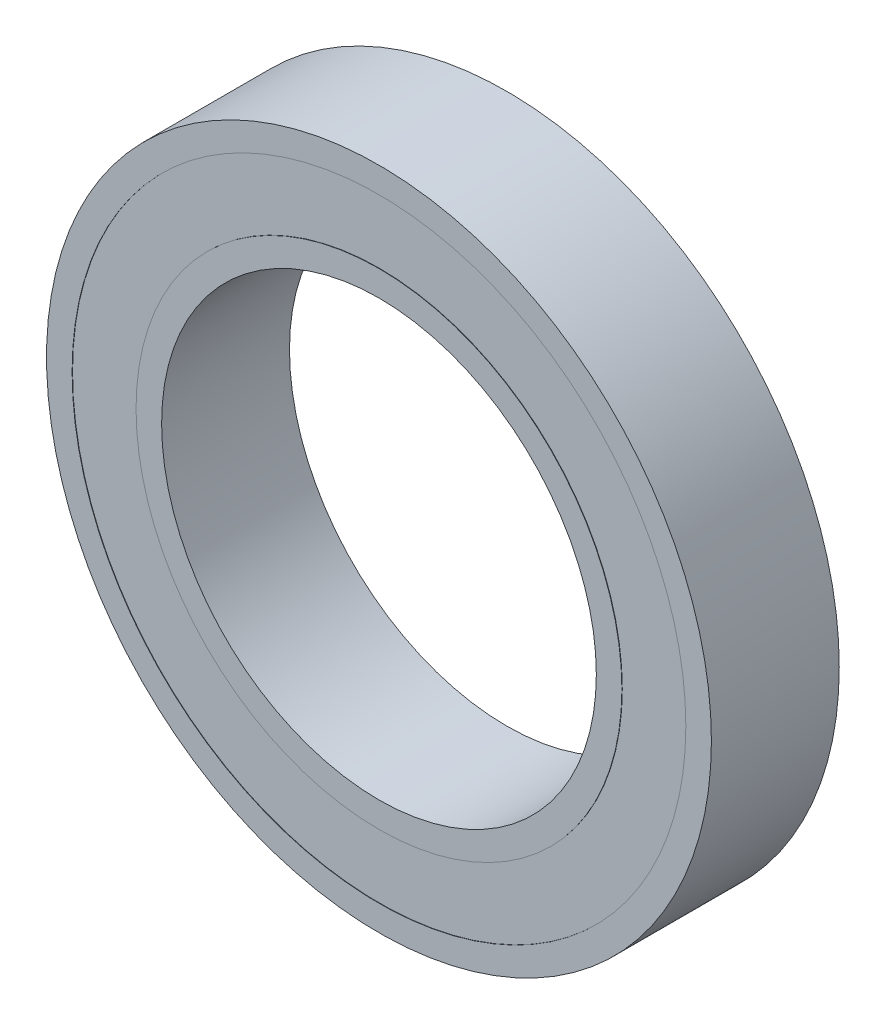
ISO-10303-21;
HEADER;
FILE_DESCRIPTION(('STEP AP214'),'2;1');
FILE_NAME('part.step','',(''),(''),'','','');
FILE_SCHEMA(('AUTOMOTIVE_DESIGN { 1 0 10303 214 1 1 1 1 }'));
ENDSEC;
DATA;
#1=APPLICATION_CONTEXT('core data for automotive mechanical design processes');
#2=APPLICATION_PROTOCOL_DEFINITION('international standard','automotive_design',2000,#1);
#3=PRODUCT_CONTEXT('',#1,'mechanical');
#4=PRODUCT('Part','Part','',(#3));
#5=PRODUCT_RELATED_PRODUCT_CATEGORY('part','',(#4));
#6=PRODUCT_DEFINITION_FORMATION('','',#4);
#7=PRODUCT_DEFINITION_CONTEXT('part definition',#1,'design');
#8=PRODUCT_DEFINITION('design','',#6,#7);
#9=PRODUCT_DEFINITION_SHAPE('','',#8);
#10=(LENGTH_UNIT() NAMED_UNIT(*) SI_UNIT(.MILLI.,.METRE.));
#11=(NAMED_UNIT(*) PLANE_ANGLE_UNIT() SI_UNIT($,.RADIAN.));
#12=(NAMED_UNIT(*) SI_UNIT($,.STERADIAN.) SOLID_ANGLE_UNIT());
#13=UNCERTAINTY_MEASURE_WITH_UNIT(LENGTH_MEASURE(1.E-05),#10,'distance_accuracy_value','');
#14=(GEOMETRIC_REPRESENTATION_CONTEXT(3) GLOBAL_UNCERTAINTY_ASSIGNED_CONTEXT((#13)) GLOBAL_UNIT_ASSIGNED_CONTEXT((#10,
#11,#12)) REPRESENTATION_CONTEXT('',''));
#15=CARTESIAN_POINT('',(0.,0.,0.));
#16=DIRECTION('',(0.,0.,1.));
#17=DIRECTION('',(1.,0.,0.));
#18=AXIS2_PLACEMENT_3D('',#15,#16,#17);
#19=CARTESIAN_POINT('',(0.,0.,-2.5));
#20=DIRECTION('',(0.,0.,1.));
#21=DIRECTION('',(1.,0.,0.));
#22=AXIS2_PLACEMENT_3D('',#19,#20,#21);
#23=CYLINDRICAL_SURFACE('',#22,12.);
#24=CARTESIAN_POINT('',(0.,0.,-2.5));
#25=DIRECTION('',(0.,0.,1.));
#26=DIRECTION('',(1.,0.,0.));
#27=AXIS2_PLACEMENT_3D('',#24,#25,#26);
#28=CIRCLE('',#27,12.);
#29=CARTESIAN_POINT('',(12.,0.,-2.5));
#30=VERTEX_POINT('',#29);
#31=EDGE_CURVE('E60',#30,#30,#28,.T.);
#32=ORIENTED_EDGE('',*,*,#31,.F.);
#33=EDGE_LOOP('',(#32));
#34=FACE_BOUND('',#33,.T.);
#35=CARTESIAN_POINT('',(0.,0.,-2.484375));
#36=DIRECTION('',(0.,0.,1.));
#37=DIRECTION('',(1.,0.,0.));
#38=AXIS2_PLACEMENT_3D('',#35,#36,#37);
#39=CIRCLE('',#38,12.);
#40=CARTESIAN_POINT('',(12.,0.,-2.484375));
#41=VERTEX_POINT('',#40);
#42=EDGE_CURVE('E11',#41,#41,#39,.F.);
#43=ORIENTED_EDGE('',*,*,#42,.F.);
#44=EDGE_LOOP('',(#43));
#45=FACE_BOUND('',#44,.T.);
#46=ADVANCED_FACE('F49',(#34,#45),#23,.F.);
#47=CARTESIAN_POINT('',(0.,0.,2.484375));
#48=DIRECTION('',(0.,0.,1.));
#49=DIRECTION('',(1.,0.,0.));
#50=AXIS2_PLACEMENT_3D('',#47,#48,#49);
#51=CIRCLE('',#50,12.);
#52=CARTESIAN_POINT('',(12.,0.,2.484375));
#53=VERTEX_POINT('',#52);
#54=EDGE_CURVE('E72',#53,#53,#51,.T.);
#55=ORIENTED_EDGE('',*,*,#54,.F.);
#56=EDGE_LOOP('',(#55));
#57=FACE_BOUND('',#56,.T.);
#58=CARTESIAN_POINT('',(0.,0.,2.5));
#59=DIRECTION('',(0.,0.,1.));
#60=DIRECTION('',(1.,0.,0.));
#61=AXIS2_PLACEMENT_3D('',#58,#59,#60);
#62=CIRCLE('',#61,12.);
#63=CARTESIAN_POINT('',(12.,0.,2.5));
#64=VERTEX_POINT('',#63);
#65=EDGE_CURVE('E69',#64,#64,#62,.T.);
#66=ORIENTED_EDGE('',*,*,#65,.T.);
#67=EDGE_LOOP('',(#66));
#68=FACE_BOUND('',#67,.T.);
#69=ADVANCED_FACE('F51',(#57,#68),#23,.F.);
#70=CARTESIAN_POINT('',(0.,0.,-2.5));
#71=DIRECTION('',(0.,0.,1.));
#72=DIRECTION('',(1.,0.,0.));
#73=AXIS2_PLACEMENT_3D('',#70,#71,#72);
#74=CYLINDRICAL_SURFACE('',#73,13.);
#75=CARTESIAN_POINT('',(0.,0.,-2.5));
#76=DIRECTION('',(0.,0.,1.));
#77=DIRECTION('',(1.,0.,0.));
#78=AXIS2_PLACEMENT_3D('',#75,#76,#77);
#79=CIRCLE('',#78,13.);
#80=CARTESIAN_POINT('',(13.,0.,-2.5));
#81=VERTEX_POINT('',#80);
#82=EDGE_CURVE('E56',#81,#81,#79,.T.);
#83=ORIENTED_EDGE('',*,*,#82,.T.);
#84=EDGE_LOOP('',(#83));
#85=FACE_BOUND('',#84,.T.);
#86=CARTESIAN_POINT('',(0.,0.,2.5));
#87=DIRECTION('',(0.,0.,1.));
#88=DIRECTION('',(1.,0.,0.));
#89=AXIS2_PLACEMENT_3D('',#86,#87,#88);
#90=CIRCLE('',#89,13.);
#91=CARTESIAN_POINT('',(13.,0.,2.5));
#92=VERTEX_POINT('',#91);
#93=EDGE_CURVE('E64',#92,#92,#90,.T.);
#94=ORIENTED_EDGE('',*,*,#93,.F.);
#95=EDGE_LOOP('',(#94));
#96=FACE_BOUND('',#95,.T.);
#97=ADVANCED_FACE('F124',(#85,#96),#74,.T.);
#98=CARTESIAN_POINT('',(0.,0.,-2.5));
#99=DIRECTION('',(0.,0.,1.));
#100=DIRECTION('',(1.,0.,0.));
#101=AXIS2_PLACEMENT_3D('',#98,#99,#100);
#102=PLANE('',#101);
#103=ORIENTED_EDGE('',*,*,#31,.T.);
#104=EDGE_LOOP('',(#103));
#105=FACE_BOUND('',#104,.T.);
#106=ORIENTED_EDGE('',*,*,#82,.F.);
#107=EDGE_LOOP('',(#106));
#108=FACE_BOUND('',#107,.T.);
#109=ADVANCED_FACE('F129',(#105,#108),#102,.F.);
#110=CARTESIAN_POINT('',(0.,0.,2.5));
#111=DIRECTION('',(0.,0.,1.));
#112=DIRECTION('',(1.,0.,0.));
#113=AXIS2_PLACEMENT_3D('',#110,#111,#112);
#114=PLANE('',#113);
#115=ORIENTED_EDGE('',*,*,#65,.F.);
#116=EDGE_LOOP('',(#115));
#117=FACE_BOUND('',#116,.T.);
#118=ORIENTED_EDGE('',*,*,#93,.T.);
#119=EDGE_LOOP('',(#118));
#120=FACE_BOUND('',#119,.T.);
#121=ADVANCED_FACE('F132',(#117,#120),#114,.T.);
#122=CARTESIAN_POINT('',(0.,0.,-2.484375));
#123=DIRECTION('',(0.,0.,1.));
#124=DIRECTION('',(1.,0.,0.));
#125=AXIS2_PLACEMENT_3D('',#122,#123,#124);
#126=PLANE('',#125);
#127=CARTESIAN_POINT('',(0.,0.,-2.484375));
#128=DIRECTION('',(0.,0.,1.));
#129=DIRECTION('',(1.,0.,0.));
#130=AXIS2_PLACEMENT_3D('',#127,#128,#129);
#131=CIRCLE('',#130,9.5);
#132=CARTESIAN_POINT('',(9.5,0.,-2.484375));
#133=VERTEX_POINT('',#132);
#134=EDGE_CURVE('E78',#133,#133,#131,.T.);
#135=ORIENTED_EDGE('',*,*,#134,.T.);
#136=EDGE_LOOP('',(#135));
#137=FACE_BOUND('',#136,.T.);
#138=ORIENTED_EDGE('',*,*,#42,.T.);
#139=EDGE_LOOP('',(#138));
#140=FACE_BOUND('',#139,.T.);
#141=ADVANCED_FACE('F138',(#137,#140),#126,.F.);
#142=CARTESIAN_POINT('',(0.,0.,2.484375));
#143=DIRECTION('',(0.,0.,1.));
#144=DIRECTION('',(1.,0.,0.));
#145=AXIS2_PLACEMENT_3D('',#142,#143,#144);
#146=PLANE('',#145);
#147=CARTESIAN_POINT('',(0.,0.,2.484375));
#148=DIRECTION('',(0.,0.,1.));
#149=DIRECTION('',(1.,0.,0.));
#150=AXIS2_PLACEMENT_3D('',#147,#148,#149);
#151=CIRCLE('',#150,9.5);
#152=CARTESIAN_POINT('',(9.5,0.,2.484375));
#153=VERTEX_POINT('',#152);
#154=EDGE_CURVE('E75',#153,#153,#151,.T.);
#155=ORIENTED_EDGE('',*,*,#154,.F.);
#156=EDGE_LOOP('',(#155));
#157=FACE_BOUND('',#156,.T.);
#158=ORIENTED_EDGE('',*,*,#54,.T.);
#159=EDGE_LOOP('',(#158));
#160=FACE_BOUND('',#159,.T.);
#161=ADVANCED_FACE('F117',(#157,#160),#146,.T.);
#162=CARTESIAN_POINT('',(0.,0.,-2.5));
#163=DIRECTION('',(0.,0.,1.));
#164=DIRECTION('',(1.,0.,0.));
#165=AXIS2_PLACEMENT_3D('',#162,#163,#164);
#166=CYLINDRICAL_SURFACE('',#165,9.5);
#167=CARTESIAN_POINT('',(0.,0.,-2.5));
#168=DIRECTION('',(0.,0.,1.));
#169=DIRECTION('',(1.,0.,0.));
#170=AXIS2_PLACEMENT_3D('',#167,#168,#169);
#171=CIRCLE('',#170,9.5);
#172=CARTESIAN_POINT('',(9.5,0.,-2.5));
#173=VERTEX_POINT('',#172);
#174=EDGE_CURVE('E81',#173,#173,#171,.T.);
#175=ORIENTED_EDGE('',*,*,#174,.T.);
#176=EDGE_LOOP('',(#175));
#177=FACE_BOUND('',#176,.T.);
#178=ORIENTED_EDGE('',*,*,#134,.F.);
#179=EDGE_LOOP('',(#178));
#180=FACE_BOUND('',#179,.T.);
#181=ADVANCED_FACE('F107',(#177,#180),#166,.T.);
#182=CARTESIAN_POINT('',(0.,0.,-2.5));
#183=DIRECTION('',(0.,0.,1.));
#184=DIRECTION('',(1.,0.,0.));
#185=AXIS2_PLACEMENT_3D('',#182,#183,#184);
#186=CYLINDRICAL_SURFACE('',#185,8.5);
#187=CARTESIAN_POINT('',(0.,0.,-2.5));
#188=DIRECTION('',(0.,0.,1.));
#189=DIRECTION('',(1.,0.,0.));
#190=AXIS2_PLACEMENT_3D('',#187,#188,#189);
#191=CIRCLE('',#190,8.5);
#192=CARTESIAN_POINT('',(8.5,0.,-2.5));
#193=VERTEX_POINT('',#192);
#194=EDGE_CURVE('E84',#193,#193,#191,.T.);
#195=ORIENTED_EDGE('',*,*,#194,.F.);
#196=EDGE_LOOP('',(#195));
#197=FACE_BOUND('',#196,.T.);
#198=CARTESIAN_POINT('',(0.,0.,2.5));
#199=DIRECTION('',(0.,0.,1.));
#200=DIRECTION('',(1.,0.,0.));
#201=AXIS2_PLACEMENT_3D('',#198,#199,#200);
#202=CIRCLE('',#201,8.5);
#203=CARTESIAN_POINT('',(8.5,0.,2.5));
#204=VERTEX_POINT('',#203);
#205=EDGE_CURVE('E90',#204,#204,#202,.T.);
#206=ORIENTED_EDGE('',*,*,#205,.T.);
#207=EDGE_LOOP('',(#206));
#208=FACE_BOUND('',#207,.T.);
#209=ADVANCED_FACE('F94',(#197,#208),#186,.F.);
#210=ORIENTED_EDGE('',*,*,#154,.T.);
#211=EDGE_LOOP('',(#210));
#212=FACE_BOUND('',#211,.T.);
#213=CARTESIAN_POINT('',(0.,0.,2.5));
#214=DIRECTION('',(0.,0.,1.));
#215=DIRECTION('',(1.,0.,0.));
#216=AXIS2_PLACEMENT_3D('',#213,#214,#215);
#217=CIRCLE('',#216,9.5);
#218=CARTESIAN_POINT('',(9.5,0.,2.5));
#219=VERTEX_POINT('',#218);
#220=EDGE_CURVE('E87',#219,#219,#217,.T.);
#221=ORIENTED_EDGE('',*,*,#220,.F.);
#222=EDGE_LOOP('',(#221));
#223=FACE_BOUND('',#222,.T.);
#224=ADVANCED_FACE('F103',(#212,#223),#166,.T.);
#225=CARTESIAN_POINT('',(0.,0.,-2.5));
#226=DIRECTION('',(0.,0.,1.));
#227=DIRECTION('',(1.,0.,0.));
#228=AXIS2_PLACEMENT_3D('',#225,#226,#227);
#229=PLANE('',#228);
#230=ORIENTED_EDGE('',*,*,#194,.T.);
#231=EDGE_LOOP('',(#230));
#232=FACE_BOUND('',#231,.T.);
#233=ORIENTED_EDGE('',*,*,#174,.F.);
#234=EDGE_LOOP('',(#233));
#235=FACE_BOUND('',#234,.T.);
#236=ADVANCED_FACE('F99',(#232,#235),#229,.F.);
#237=CARTESIAN_POINT('',(0.,0.,2.5));
#238=DIRECTION('',(0.,0.,1.));
#239=DIRECTION('',(1.,0.,0.));
#240=AXIS2_PLACEMENT_3D('',#237,#238,#239);
#241=PLANE('',#240);
#242=ORIENTED_EDGE('',*,*,#205,.F.);
#243=EDGE_LOOP('',(#242));
#244=FACE_BOUND('',#243,.T.);
#245=ORIENTED_EDGE('',*,*,#220,.T.);
#246=EDGE_LOOP('',(#245));
#247=FACE_BOUND('',#246,.T.);
#248=ADVANCED_FACE('F96',(#244,#247),#241,.T.);
#249=CLOSED_SHELL('',(#46,#69,#97,#109,#121,#141,#161,#181,#209,#224,#236,#248));
#250=MANIFOLD_SOLID_BREP('B2',#249);
#251=ADVANCED_BREP_SHAPE_REPRESENTATION('',(#18,#250),#14);
#252=SHAPE_DEFINITION_REPRESENTATION(#9,#251);
ENDSEC;
END-ISO-10303-21;
